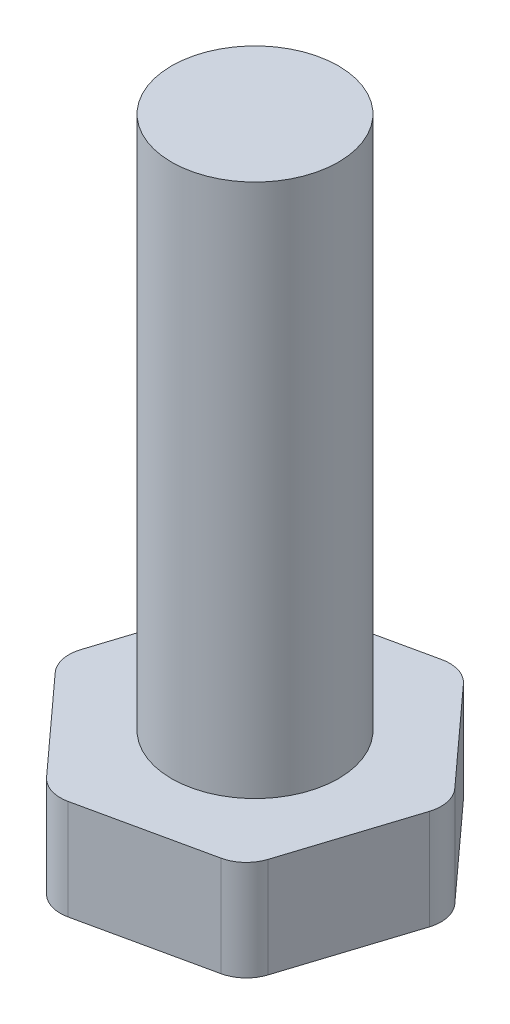
ISO-10303-21;
HEADER;
FILE_DESCRIPTION(('STEP AP214'),'2;1');
FILE_NAME('part.step','',(''),(''),'','','');
FILE_SCHEMA(('AUTOMOTIVE_DESIGN { 1 0 10303 214 1 1 1 1 }'));
ENDSEC;
DATA;
#1=APPLICATION_CONTEXT('core data for automotive mechanical design processes');
#2=APPLICATION_PROTOCOL_DEFINITION('international standard','automotive_design',2000,#1);
#3=PRODUCT_CONTEXT('',#1,'mechanical');
#4=PRODUCT('Part','Part','',(#3));
#5=PRODUCT_RELATED_PRODUCT_CATEGORY('part','',(#4));
#6=PRODUCT_DEFINITION_FORMATION('','',#4);
#7=PRODUCT_DEFINITION_CONTEXT('part definition',#1,'design');
#8=PRODUCT_DEFINITION('design','',#6,#7);
#9=PRODUCT_DEFINITION_SHAPE('','',#8);
#10=(LENGTH_UNIT() NAMED_UNIT(*) SI_UNIT(.MILLI.,.METRE.));
#11=(NAMED_UNIT(*) PLANE_ANGLE_UNIT() SI_UNIT($,.RADIAN.));
#12=(NAMED_UNIT(*) SI_UNIT($,.STERADIAN.) SOLID_ANGLE_UNIT());
#13=UNCERTAINTY_MEASURE_WITH_UNIT(LENGTH_MEASURE(1.E-05),#10,'distance_accuracy_value','');
#14=(GEOMETRIC_REPRESENTATION_CONTEXT(3) GLOBAL_UNCERTAINTY_ASSIGNED_CONTEXT((#13)) GLOBAL_UNIT_ASSIGNED_CONTEXT((#10,
#11,#12)) REPRESENTATION_CONTEXT('',''));
#15=CARTESIAN_POINT('',(0.,0.,0.));
#16=DIRECTION('',(0.,0.,1.));
#17=DIRECTION('',(1.,0.,0.));
#18=AXIS2_PLACEMENT_3D('',#15,#16,#17);
#19=CARTESIAN_POINT('',(0.,3.,0.));
#20=DIRECTION('',(0.,1.,0.));
#21=DIRECTION('',(0.,0.,1.));
#22=AXIS2_PLACEMENT_3D('',#19,#20,#21);
#23=PLANE('',#22);
#24=DIRECTION('',(0.672672793996319,0.,0.739940073395938));
#25=VECTOR('',#24,1.);
#26=CARTESIAN_POINT('',(-0.924145968174006,3.,-6.80803541879403));
#27=LINE('',#26,#25);
#28=CARTESIAN_POINT('',(-0.535778149483693,3.,-6.3808308182347));
#29=VERTEX_POINT('',#28);
#30=CARTESIAN_POINT('',(2.05085018311728,3.,-3.53553965237367));
#31=VERTEX_POINT('',#30);
#32=EDGE_CURVE('E217',#29,#31,#27,.T.);
#33=ORIENTED_EDGE('',*,*,#32,.T.);
#34=CARTESIAN_POINT('',(2.79079025651322,3.,-4.20821244636999));
#35=DIRECTION('',(0.,1.,0.));
#36=DIRECTION('',(0.,0.,1.));
#37=AXIS2_PLACEMENT_3D('',#34,#35,#36);
#38=CIRCLE('',#37,1.);
#39=CARTESIAN_POINT('',(3.00337194785072,3.,-3.23106914853283));
#40=VERTEX_POINT('',#39);
#41=EDGE_CURVE('E178',#31,#40,#38,.T.);
#42=ORIENTED_EDGE('',*,*,#41,.T.);
#43=DIRECTION('',(0.977143297837164,0.,-0.212581691337499));
#44=VECTOR('',#43,1.);
#45=CARTESIAN_POINT('',(2.43921800180759,3.,-3.10833505181434));
#46=LINE('',#45,#44);
#47=CARTESIAN_POINT('',(6.76078054495028,3.,-4.04850941178334));
#48=VERTEX_POINT('',#47);
#49=EDGE_CURVE('E141',#40,#48,#46,.T.);
#50=ORIENTED_EDGE('',*,*,#49,.T.);
#51=CARTESIAN_POINT('',(6.54819885361278,3.,-5.0256527096205));
#52=DIRECTION('',(0.,1.,0.));
#53=DIRECTION('',(0.,0.,1.));
#54=AXIS2_PLACEMENT_3D('',#51,#52,#53);
#55=CIRCLE('',#54,1.);
#56=CARTESIAN_POINT('',(7.50072061834622,3.,-4.72118220577966));
#57=VERTEX_POINT('',#56);
#58=EDGE_CURVE('E54',#48,#57,#55,.T.);
#59=ORIENTED_EDGE('',*,*,#58,.T.);
#60=DIRECTION('',(0.304470503840845,0.,-0.952521764733437));
#61=VECTOR('',#60,1.);
#62=CARTESIAN_POINT('',(7.32493449099341,3.,-4.17124350850183));
#63=LINE('',#62,#61);
#64=CARTESIAN_POINT('',(8.67150088284482,3.,-8.3839136348912));
#65=VERTEX_POINT('',#64);
#66=EDGE_CURVE('E157',#57,#65,#63,.T.);
#67=ORIENTED_EDGE('',*,*,#66,.T.);
#68=CARTESIAN_POINT('',(7.71897911811138,3.,-8.68838413873204));
#69=DIRECTION('',(0.,1.,0.));
#70=DIRECTION('',(0.,0.,1.));
#71=AXIS2_PLACEMENT_3D('',#68,#69,#70);
#72=CIRCLE('',#71,1.);
#73=CARTESIAN_POINT('',(8.45891919150732,3.,-9.36105693272836));
#74=VERTEX_POINT('',#73);
#75=EDGE_CURVE('E173',#65,#74,#72,.T.);
#76=ORIENTED_EDGE('',*,*,#75,.T.);
#77=DIRECTION('',(-0.672672793996319,0.,-0.739940073395938));
#78=VECTOR('',#77,1.);
#79=CARTESIAN_POINT('',(8.84728701019763,3.,-8.93385233216902));
#80=LINE('',#79,#78);
#81=CARTESIAN_POINT('',(5.87229085890635,3.,-12.2063480985894));
#82=VERTEX_POINT('',#81);
#83=EDGE_CURVE('E151',#74,#82,#80,.T.);
#84=ORIENTED_EDGE('',*,*,#83,.T.);
#85=CARTESIAN_POINT('',(5.13235078551042,3.,-11.5336753045931));
#86=DIRECTION('',(0.,1.,0.));
#87=DIRECTION('',(0.,0.,1.));
#88=AXIS2_PLACEMENT_3D('',#85,#86,#87);
#89=CIRCLE('',#88,1.);
#90=CARTESIAN_POINT('',(4.91976909417292,3.,-12.5108186024302));
#91=VERTEX_POINT('',#90);
#92=EDGE_CURVE('E169',#82,#91,#89,.T.);
#93=ORIENTED_EDGE('',*,*,#92,.T.);
#94=DIRECTION('',(-0.977143297837164,0.,0.212581691337499));
#95=VECTOR('',#94,1.);
#96=CARTESIAN_POINT('',(5.48392304021604,3.,-12.6335526991487));
#97=LINE('',#96,#95);
#98=CARTESIAN_POINT('',(1.16236049707335,3.,-11.6933783391797));
#99=VERTEX_POINT('',#98);
#100=EDGE_CURVE('E203',#91,#99,#97,.T.);
#101=ORIENTED_EDGE('',*,*,#100,.T.);
#102=CARTESIAN_POINT('',(1.37494218841085,3.,-10.7162350413425));
#103=DIRECTION('',(0.,1.,0.));
#104=DIRECTION('',(0.,0.,1.));
#105=AXIS2_PLACEMENT_3D('',#102,#103,#104);
#106=CIRCLE('',#105,1.);
#107=CARTESIAN_POINT('',(0.422420423677408,3.,-11.0207055451834));
#108=VERTEX_POINT('',#107);
#109=EDGE_CURVE('E171',#99,#108,#106,.T.);
#110=ORIENTED_EDGE('',*,*,#109,.T.);
#111=DIRECTION('',(-0.304470503840846,0.,0.952521764733437));
#112=VECTOR('',#111,1.);
#113=CARTESIAN_POINT('',(0.598206551030222,3.,-11.5706442424612));
#114=LINE('',#113,#112);
#115=CARTESIAN_POINT('',(-0.748359840821193,3.,-7.35797411607186));
#116=VERTEX_POINT('',#115);
#117=EDGE_CURVE('E220',#108,#116,#114,.T.);
#118=ORIENTED_EDGE('',*,*,#117,.T.);
#119=CARTESIAN_POINT('',(0.204161923912245,3.,-7.05350361223102));
#120=DIRECTION('',(0.,1.,0.));
#121=DIRECTION('',(0.,0.,1.));
#122=AXIS2_PLACEMENT_3D('',#119,#120,#121);
#123=CIRCLE('',#122,1.);
#124=EDGE_CURVE('E176',#116,#29,#123,.T.);
#125=ORIENTED_EDGE('',*,*,#124,.T.);
#126=EDGE_LOOP('',(#33,#42,#50,#59,#67,#76,#84,#93,#101,#110,#118,#125));
#127=FACE_BOUND('',#126,.T.);
#128=CARTESIAN_POINT('',(3.96157052101181,3.,-7.87094387548153));
#129=DIRECTION('',(0.,1.,0.));
#130=DIRECTION('',(0.,0.,1.));
#131=AXIS2_PLACEMENT_3D('',#128,#129,#130);
#132=CIRCLE('',#131,2.5);
#133=CARTESIAN_POINT('',(3.96157052101181,3.,-5.37094387548153));
#134=VERTEX_POINT('',#133);
#135=EDGE_CURVE('E226',#134,#134,#132,.T.);
#136=ORIENTED_EDGE('',*,*,#135,.F.);
#137=EDGE_LOOP('',(#136));
#138=FACE_BOUND('',#137,.T.);
#139=ADVANCED_FACE('F32',(#127,#138),#23,.T.);
#140=CARTESIAN_POINT('',(8.84728701019763,3.,-8.93385233216902));
#141=DIRECTION('',(-0.739940073395938,0.,0.672672793996319));
#142=DIRECTION('',(0.672672793996319,0.,0.739940073395938));
#143=AXIS2_PLACEMENT_3D('',#140,#141,#142);
#144=PLANE('',#143);
#145=ORIENTED_EDGE('',*,*,#83,.F.);
#146=DIRECTION('',(0.,-1.,0.));
#147=VECTOR('',#146,1.);
#148=CARTESIAN_POINT('',(8.45891919150732,3.,-9.36105693272836));
#149=LINE('',#148,#147);
#150=CARTESIAN_POINT('',(8.45891919150732,0.,-9.36105693272836));
#151=VERTEX_POINT('',#150);
#152=EDGE_CURVE('E191',#74,#151,#149,.T.);
#153=ORIENTED_EDGE('',*,*,#152,.T.);
#154=DIRECTION('',(-0.672672793996319,0.,-0.739940073395938));
#155=VECTOR('',#154,1.);
#156=CARTESIAN_POINT('',(8.84728701019763,0.,-8.93385233216902));
#157=LINE('',#156,#155);
#158=CARTESIAN_POINT('',(5.87229085890635,0.,-12.2063480985894));
#159=VERTEX_POINT('',#158);
#160=EDGE_CURVE('E209',#151,#159,#157,.T.);
#161=ORIENTED_EDGE('',*,*,#160,.T.);
#162=DIRECTION('',(0.,-1.,0.));
#163=VECTOR('',#162,1.);
#164=CARTESIAN_POINT('',(5.87229085890635,3.,-12.2063480985894));
#165=LINE('',#164,#163);
#166=EDGE_CURVE('E189',#159,#82,#165,.F.);
#167=ORIENTED_EDGE('',*,*,#166,.T.);
#168=EDGE_LOOP('',(#145,#153,#161,#167));
#169=FACE_BOUND('',#168,.T.);
#170=ADVANCED_FACE('F241',(#169),#144,.F.);
#171=CARTESIAN_POINT('',(5.48392304021604,3.,-12.6335526991487));
#172=DIRECTION('',(0.212581691337499,0.,0.977143297837164));
#173=DIRECTION('',(0.977143297837164,0.,-0.212581691337499));
#174=AXIS2_PLACEMENT_3D('',#171,#172,#173);
#175=PLANE('',#174);
#176=DIRECTION('',(-0.977143297837164,0.,0.212581691337499));
#177=VECTOR('',#176,1.);
#178=CARTESIAN_POINT('',(5.48392304021604,0.,-12.6335526991487));
#179=LINE('',#178,#177);
#180=CARTESIAN_POINT('',(4.91976909417292,0.,-12.5108186024302));
#181=VERTEX_POINT('',#180);
#182=CARTESIAN_POINT('',(1.16236049707335,0.,-11.6933783391797));
#183=VERTEX_POINT('',#182);
#184=EDGE_CURVE('E200',#181,#183,#179,.T.);
#185=ORIENTED_EDGE('',*,*,#184,.T.);
#186=DIRECTION('',(0.,-1.,0.));
#187=VECTOR('',#186,1.);
#188=CARTESIAN_POINT('',(1.16236049707335,3.,-11.6933783391797));
#189=LINE('',#188,#187);
#190=EDGE_CURVE('E11',#183,#99,#189,.F.);
#191=ORIENTED_EDGE('',*,*,#190,.T.);
#192=ORIENTED_EDGE('',*,*,#100,.F.);
#193=DIRECTION('',(0.,-1.,0.));
#194=VECTOR('',#193,1.);
#195=CARTESIAN_POINT('',(4.91976909417292,3.,-12.5108186024302));
#196=LINE('',#195,#194);
#197=EDGE_CURVE('E40',#91,#181,#196,.T.);
#198=ORIENTED_EDGE('',*,*,#197,.T.);
#199=EDGE_LOOP('',(#185,#191,#192,#198));
#200=FACE_BOUND('',#199,.T.);
#201=ADVANCED_FACE('F199',(#200),#175,.F.);
#202=CARTESIAN_POINT('',(0.598206551030222,3.,-11.5706442424612));
#203=DIRECTION('',(0.952521764733437,0.,0.304470503840846));
#204=DIRECTION('',(0.304470503840846,0.,-0.952521764733437));
#205=AXIS2_PLACEMENT_3D('',#202,#203,#204);
#206=PLANE('',#205);
#207=DIRECTION('',(-0.304470503840846,0.,0.952521764733437));
#208=VECTOR('',#207,1.);
#209=CARTESIAN_POINT('',(0.598206551030222,0.,-11.5706442424612));
#210=LINE('',#209,#208);
#211=CARTESIAN_POINT('',(0.422420423677408,0.,-11.0207055451834));
#212=VERTEX_POINT('',#211);
#213=CARTESIAN_POINT('',(-0.748359840821193,0.,-7.35797411607186));
#214=VERTEX_POINT('',#213);
#215=EDGE_CURVE('E153',#212,#214,#210,.T.);
#216=ORIENTED_EDGE('',*,*,#215,.T.);
#217=DIRECTION('',(0.,-1.,0.));
#218=VECTOR('',#217,1.);
#219=CARTESIAN_POINT('',(-0.748359840821193,3.,-7.35797411607186));
#220=LINE('',#219,#218);
#221=EDGE_CURVE('E183',#214,#116,#220,.F.);
#222=ORIENTED_EDGE('',*,*,#221,.T.);
#223=ORIENTED_EDGE('',*,*,#117,.F.);
#224=DIRECTION('',(0.,-1.,0.));
#225=VECTOR('',#224,1.);
#226=CARTESIAN_POINT('',(0.422420423677408,3.,-11.0207055451834));
#227=LINE('',#226,#225);
#228=EDGE_CURVE('E180',#108,#212,#227,.T.);
#229=ORIENTED_EDGE('',*,*,#228,.T.);
#230=EDGE_LOOP('',(#216,#222,#223,#229));
#231=FACE_BOUND('',#230,.T.);
#232=ADVANCED_FACE('F260',(#231),#206,.F.);
#233=CARTESIAN_POINT('',(-0.924145968174006,3.,-6.80803541879403));
#234=DIRECTION('',(0.739940073395938,0.,-0.672672793996319));
#235=DIRECTION('',(-0.672672793996319,0.,-0.739940073395938));
#236=AXIS2_PLACEMENT_3D('',#233,#234,#235);
#237=PLANE('',#236);
#238=DIRECTION('',(0.672672793996319,0.,0.739940073395938));
#239=VECTOR('',#238,1.);
#240=CARTESIAN_POINT('',(-0.924145968174006,0.,-6.80803541879403));
#241=LINE('',#240,#239);
#242=CARTESIAN_POINT('',(-0.535778149483693,0.,-6.3808308182347));
#243=VERTEX_POINT('',#242);
#244=CARTESIAN_POINT('',(2.05085018311728,0.,-3.53553965237367));
#245=VERTEX_POINT('',#244);
#246=EDGE_CURVE('E149',#243,#245,#241,.T.);
#247=ORIENTED_EDGE('',*,*,#246,.T.);
#248=DIRECTION('',(0.,-1.,0.));
#249=VECTOR('',#248,1.);
#250=CARTESIAN_POINT('',(2.05085018311728,3.,-3.53553965237367));
#251=LINE('',#250,#249);
#252=EDGE_CURVE('E127',#245,#31,#251,.F.);
#253=ORIENTED_EDGE('',*,*,#252,.T.);
#254=ORIENTED_EDGE('',*,*,#32,.F.);
#255=DIRECTION('',(0.,-1.,0.));
#256=VECTOR('',#255,1.);
#257=CARTESIAN_POINT('',(-0.535778149483693,3.,-6.3808308182347));
#258=LINE('',#257,#256);
#259=EDGE_CURVE('E132',#29,#243,#258,.T.);
#260=ORIENTED_EDGE('',*,*,#259,.T.);
#261=EDGE_LOOP('',(#247,#253,#254,#260));
#262=FACE_BOUND('',#261,.T.);
#263=ADVANCED_FACE('F257',(#262),#237,.F.);
#264=CARTESIAN_POINT('',(2.43921800180759,3.,-3.10833505181434));
#265=DIRECTION('',(-0.212581691337499,0.,-0.977143297837164));
#266=DIRECTION('',(-0.977143297837164,0.,0.212581691337499));
#267=AXIS2_PLACEMENT_3D('',#264,#265,#266);
#268=PLANE('',#267);
#269=ORIENTED_EDGE('',*,*,#49,.F.);
#270=DIRECTION('',(0.,-1.,0.));
#271=VECTOR('',#270,1.);
#272=CARTESIAN_POINT('',(3.00337194785072,3.,-3.23106914853283));
#273=LINE('',#272,#271);
#274=CARTESIAN_POINT('',(3.00337194785072,0.,-3.23106914853283));
#275=VERTEX_POINT('',#274);
#276=EDGE_CURVE('E126',#40,#275,#273,.T.);
#277=ORIENTED_EDGE('',*,*,#276,.T.);
#278=DIRECTION('',(0.977143297837164,0.,-0.212581691337499));
#279=VECTOR('',#278,1.);
#280=CARTESIAN_POINT('',(2.43921800180759,0.,-3.10833505181434));
#281=LINE('',#280,#279);
#282=CARTESIAN_POINT('',(6.76078054495028,0.,-4.04850941178334));
#283=VERTEX_POINT('',#282);
#284=EDGE_CURVE('E139',#275,#283,#281,.T.);
#285=ORIENTED_EDGE('',*,*,#284,.T.);
#286=DIRECTION('',(0.,-1.,0.));
#287=VECTOR('',#286,1.);
#288=CARTESIAN_POINT('',(6.76078054495028,3.,-4.04850941178334));
#289=LINE('',#288,#287);
#290=EDGE_CURVE('E143',#283,#48,#289,.F.);
#291=ORIENTED_EDGE('',*,*,#290,.T.);
#292=EDGE_LOOP('',(#269,#277,#285,#291));
#293=FACE_BOUND('',#292,.T.);
#294=ADVANCED_FACE('F138',(#293),#268,.F.);
#295=CARTESIAN_POINT('',(7.32493449099341,3.,-4.17124350850183));
#296=DIRECTION('',(-0.952521764733437,0.,-0.304470503840845));
#297=DIRECTION('',(-0.304470503840845,0.,0.952521764733437));
#298=AXIS2_PLACEMENT_3D('',#295,#296,#297);
#299=PLANE('',#298);
#300=ORIENTED_EDGE('',*,*,#66,.F.);
#301=DIRECTION('',(0.,-1.,0.));
#302=VECTOR('',#301,1.);
#303=CARTESIAN_POINT('',(7.50072061834622,3.,-4.72118220577966));
#304=LINE('',#303,#302);
#305=CARTESIAN_POINT('',(7.50072061834622,0.,-4.72118220577966));
#306=VERTEX_POINT('',#305);
#307=EDGE_CURVE('E186',#57,#306,#304,.T.);
#308=ORIENTED_EDGE('',*,*,#307,.T.);
#309=DIRECTION('',(0.304470503840845,0.,-0.952521764733437));
#310=VECTOR('',#309,1.);
#311=CARTESIAN_POINT('',(7.32493449099341,0.,-4.17124350850183));
#312=LINE('',#311,#310);
#313=CARTESIAN_POINT('',(8.67150088284482,0.,-8.3839136348912));
#314=VERTEX_POINT('',#313);
#315=EDGE_CURVE('E148',#306,#314,#312,.T.);
#316=ORIENTED_EDGE('',*,*,#315,.T.);
#317=DIRECTION('',(0.,-1.,0.));
#318=VECTOR('',#317,1.);
#319=CARTESIAN_POINT('',(8.67150088284482,3.,-8.3839136348912));
#320=LINE('',#319,#318);
#321=EDGE_CURVE('E47',#314,#65,#320,.F.);
#322=ORIENTED_EDGE('',*,*,#321,.T.);
#323=EDGE_LOOP('',(#300,#308,#316,#322));
#324=FACE_BOUND('',#323,.T.);
#325=ADVANCED_FACE('F252',(#324),#299,.F.);
#326=CARTESIAN_POINT('',(0.,0.,0.));
#327=DIRECTION('',(0.,1.,0.));
#328=DIRECTION('',(0.,0.,1.));
#329=AXIS2_PLACEMENT_3D('',#326,#327,#328);
#330=PLANE('',#329);
#331=ORIENTED_EDGE('',*,*,#284,.F.);
#332=CARTESIAN_POINT('',(2.79079025651322,0.,-4.20821244636999));
#333=DIRECTION('',(0.,1.,0.));
#334=DIRECTION('',(0.,0.,1.));
#335=AXIS2_PLACEMENT_3D('',#332,#333,#334);
#336=CIRCLE('',#335,1.);
#337=EDGE_CURVE('E122',#275,#245,#336,.F.);
#338=ORIENTED_EDGE('',*,*,#337,.T.);
#339=ORIENTED_EDGE('',*,*,#246,.F.);
#340=CARTESIAN_POINT('',(0.204161923912245,0.,-7.05350361223102));
#341=DIRECTION('',(0.,1.,0.));
#342=DIRECTION('',(0.,0.,1.));
#343=AXIS2_PLACEMENT_3D('',#340,#341,#342);
#344=CIRCLE('',#343,1.);
#345=EDGE_CURVE('E133',#243,#214,#344,.F.);
#346=ORIENTED_EDGE('',*,*,#345,.T.);
#347=ORIENTED_EDGE('',*,*,#215,.F.);
#348=CARTESIAN_POINT('',(1.37494218841085,0.,-10.7162350413425));
#349=DIRECTION('',(0.,1.,0.));
#350=DIRECTION('',(0.,0.,1.));
#351=AXIS2_PLACEMENT_3D('',#348,#349,#350);
#352=CIRCLE('',#351,1.);
#353=EDGE_CURVE('E160',#212,#183,#352,.F.);
#354=ORIENTED_EDGE('',*,*,#353,.T.);
#355=ORIENTED_EDGE('',*,*,#184,.F.);
#356=CARTESIAN_POINT('',(5.13235078551042,0.,-11.5336753045931));
#357=DIRECTION('',(0.,1.,0.));
#358=DIRECTION('',(0.,0.,1.));
#359=AXIS2_PLACEMENT_3D('',#356,#357,#358);
#360=CIRCLE('',#359,1.);
#361=EDGE_CURVE('E142',#181,#159,#360,.F.);
#362=ORIENTED_EDGE('',*,*,#361,.T.);
#363=ORIENTED_EDGE('',*,*,#160,.F.);
#364=CARTESIAN_POINT('',(7.71897911811138,0.,-8.68838413873204));
#365=DIRECTION('',(0.,1.,0.));
#366=DIRECTION('',(0.,0.,1.));
#367=AXIS2_PLACEMENT_3D('',#364,#365,#366);
#368=CIRCLE('',#367,1.);
#369=EDGE_CURVE('E162',#151,#314,#368,.F.);
#370=ORIENTED_EDGE('',*,*,#369,.T.);
#371=ORIENTED_EDGE('',*,*,#315,.F.);
#372=CARTESIAN_POINT('',(6.54819885361278,0.,-5.0256527096205));
#373=DIRECTION('',(0.,1.,0.));
#374=DIRECTION('',(0.,0.,1.));
#375=AXIS2_PLACEMENT_3D('',#372,#373,#374);
#376=CIRCLE('',#375,1.);
#377=EDGE_CURVE('E147',#306,#283,#376,.F.);
#378=ORIENTED_EDGE('',*,*,#377,.T.);
#379=EDGE_LOOP('',(#331,#338,#339,#346,#347,#354,#355,#362,#363,#370,#371,#378));
#380=FACE_BOUND('',#379,.T.);
#381=ADVANCED_FACE('F145',(#380),#330,.F.);
#382=CARTESIAN_POINT('',(3.96157052101181,19.,-7.87094387548153));
#383=DIRECTION('',(0.,-1.,0.));
#384=DIRECTION('',(0.,0.,-1.));
#385=AXIS2_PLACEMENT_3D('',#382,#383,#384);
#386=CYLINDRICAL_SURFACE('',#385,2.5);
#387=CARTESIAN_POINT('',(3.96157052101181,19.,-7.87094387548153));
#388=DIRECTION('',(0.,1.,0.));
#389=DIRECTION('',(0.,0.,1.));
#390=AXIS2_PLACEMENT_3D('',#387,#388,#389);
#391=CIRCLE('',#390,2.5);
#392=CARTESIAN_POINT('',(3.96157052101181,19.,-5.37094387548153));
#393=VERTEX_POINT('',#392);
#394=EDGE_CURVE('E212',#393,#393,#391,.T.);
#395=ORIENTED_EDGE('',*,*,#394,.F.);
#396=EDGE_LOOP('',(#395));
#397=FACE_BOUND('',#396,.T.);
#398=ORIENTED_EDGE('',*,*,#135,.T.);
#399=EDGE_LOOP('',(#398));
#400=FACE_BOUND('',#399,.T.);
#401=ADVANCED_FACE('F234',(#397,#400),#386,.T.);
#402=CARTESIAN_POINT('',(3.96157052101181,19.,-7.87094387548153));
#403=DIRECTION('',(0.,1.,0.));
#404=DIRECTION('',(0.,0.,1.));
#405=AXIS2_PLACEMENT_3D('',#402,#403,#404);
#406=PLANE('',#405);
#407=ORIENTED_EDGE('',*,*,#394,.T.);
#408=EDGE_LOOP('',(#407));
#409=FACE_BOUND('',#408,.T.);
#410=ADVANCED_FACE('F232',(#409),#406,.T.);
#411=CARTESIAN_POINT('',(2.79079025651322,3.,-4.20821244636999));
#412=DIRECTION('',(0.,-1.,0.));
#413=DIRECTION('',(0.,0.,-1.));
#414=AXIS2_PLACEMENT_3D('',#411,#412,#413);
#415=CYLINDRICAL_SURFACE('',#414,1.);
#416=ORIENTED_EDGE('',*,*,#41,.F.);
#417=ORIENTED_EDGE('',*,*,#252,.F.);
#418=ORIENTED_EDGE('',*,*,#337,.F.);
#419=ORIENTED_EDGE('',*,*,#276,.F.);
#420=EDGE_LOOP('',(#416,#417,#418,#419));
#421=FACE_BOUND('',#420,.T.);
#422=ADVANCED_FACE('F125',(#421),#415,.T.);
#423=CARTESIAN_POINT('',(0.204161923912245,3.,-7.05350361223102));
#424=DIRECTION('',(0.,-1.,0.));
#425=DIRECTION('',(0.,0.,-1.));
#426=AXIS2_PLACEMENT_3D('',#423,#424,#425);
#427=CYLINDRICAL_SURFACE('',#426,1.);
#428=ORIENTED_EDGE('',*,*,#124,.F.);
#429=ORIENTED_EDGE('',*,*,#221,.F.);
#430=ORIENTED_EDGE('',*,*,#345,.F.);
#431=ORIENTED_EDGE('',*,*,#259,.F.);
#432=EDGE_LOOP('',(#428,#429,#430,#431));
#433=FACE_BOUND('',#432,.T.);
#434=ADVANCED_FACE('F269',(#433),#427,.T.);
#435=CARTESIAN_POINT('',(6.54819885361278,3.,-5.0256527096205));
#436=DIRECTION('',(0.,-1.,0.));
#437=DIRECTION('',(0.,0.,-1.));
#438=AXIS2_PLACEMENT_3D('',#435,#436,#437);
#439=CYLINDRICAL_SURFACE('',#438,1.);
#440=ORIENTED_EDGE('',*,*,#58,.F.);
#441=ORIENTED_EDGE('',*,*,#290,.F.);
#442=ORIENTED_EDGE('',*,*,#377,.F.);
#443=ORIENTED_EDGE('',*,*,#307,.F.);
#444=EDGE_LOOP('',(#440,#441,#442,#443));
#445=FACE_BOUND('',#444,.T.);
#446=ADVANCED_FACE('F272',(#445),#439,.T.);
#447=CARTESIAN_POINT('',(7.71897911811138,3.,-8.68838413873204));
#448=DIRECTION('',(0.,-1.,0.));
#449=DIRECTION('',(0.,0.,-1.));
#450=AXIS2_PLACEMENT_3D('',#447,#448,#449);
#451=CYLINDRICAL_SURFACE('',#450,1.);
#452=ORIENTED_EDGE('',*,*,#75,.F.);
#453=ORIENTED_EDGE('',*,*,#321,.F.);
#454=ORIENTED_EDGE('',*,*,#369,.F.);
#455=ORIENTED_EDGE('',*,*,#152,.F.);
#456=EDGE_LOOP('',(#452,#453,#454,#455));
#457=FACE_BOUND('',#456,.T.);
#458=ADVANCED_FACE('F276',(#457),#451,.T.);
#459=CARTESIAN_POINT('',(1.37494218841085,3.,-10.7162350413425));
#460=DIRECTION('',(0.,-1.,0.));
#461=DIRECTION('',(0.,0.,-1.));
#462=AXIS2_PLACEMENT_3D('',#459,#460,#461);
#463=CYLINDRICAL_SURFACE('',#462,1.);
#464=ORIENTED_EDGE('',*,*,#109,.F.);
#465=ORIENTED_EDGE('',*,*,#190,.F.);
#466=ORIENTED_EDGE('',*,*,#353,.F.);
#467=ORIENTED_EDGE('',*,*,#228,.F.);
#468=EDGE_LOOP('',(#464,#465,#466,#467));
#469=FACE_BOUND('',#468,.T.);
#470=ADVANCED_FACE('F279',(#469),#463,.T.);
#471=CARTESIAN_POINT('',(5.13235078551042,3.,-11.5336753045931));
#472=DIRECTION('',(0.,-1.,0.));
#473=DIRECTION('',(0.,0.,-1.));
#474=AXIS2_PLACEMENT_3D('',#471,#472,#473);
#475=CYLINDRICAL_SURFACE('',#474,1.);
#476=ORIENTED_EDGE('',*,*,#92,.F.);
#477=ORIENTED_EDGE('',*,*,#166,.F.);
#478=ORIENTED_EDGE('',*,*,#361,.F.);
#479=ORIENTED_EDGE('',*,*,#197,.F.);
#480=EDGE_LOOP('',(#476,#477,#478,#479));
#481=FACE_BOUND('',#480,.T.);
#482=ADVANCED_FACE('F34',(#481),#475,.T.);
#483=CLOSED_SHELL('',(#139,#170,#201,#232,#263,#294,#325,#381,#401,#410,#422,#434,#446,#458,
#470,#482));
#484=MANIFOLD_SOLID_BREP('B2',#483);
#485=ADVANCED_BREP_SHAPE_REPRESENTATION('',(#18,#484),#14);
#486=SHAPE_DEFINITION_REPRESENTATION(#9,#485);
ENDSEC;
END-ISO-10303-21;
